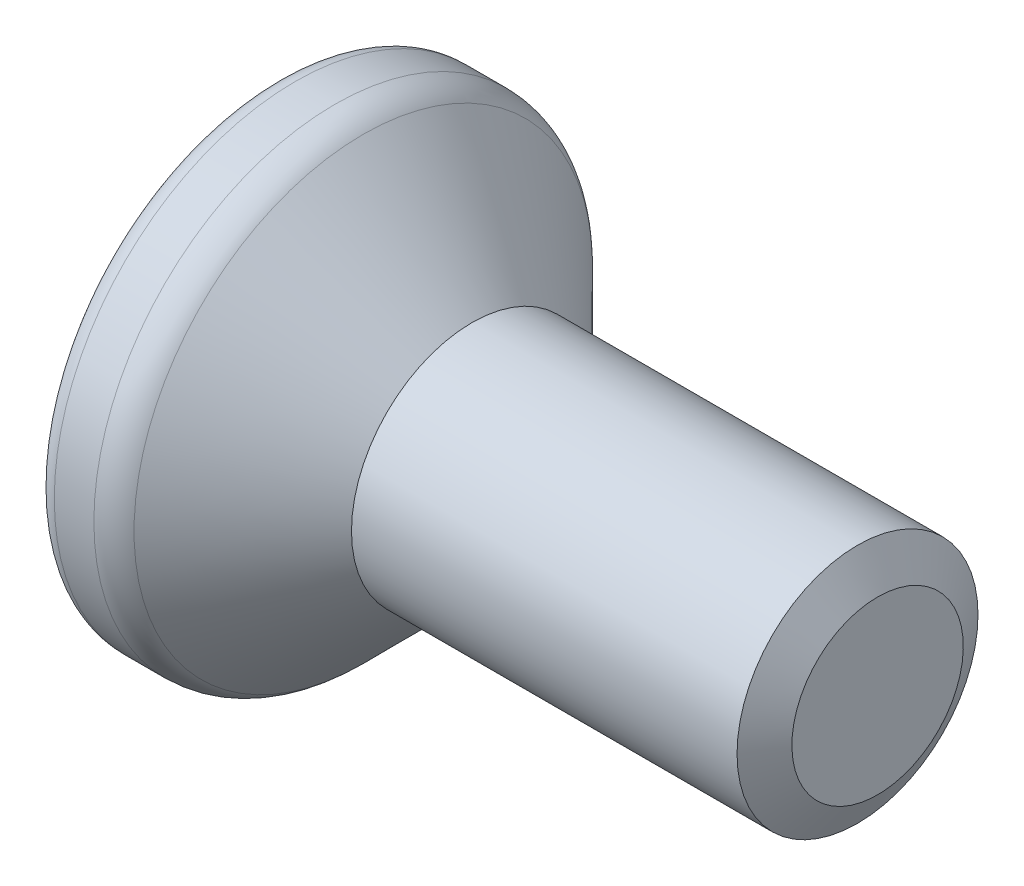
ISO-10303-21;
HEADER;
FILE_DESCRIPTION(('STEP AP214'),'2;1');
FILE_NAME('part.step','',(''),(''),'','','');
FILE_SCHEMA(('AUTOMOTIVE_DESIGN { 1 0 10303 214 1 1 1 1 }'));
ENDSEC;
DATA;
#1=APPLICATION_CONTEXT('core data for automotive mechanical design processes');
#2=APPLICATION_PROTOCOL_DEFINITION('international standard','automotive_design',2000,#1);
#3=PRODUCT_CONTEXT('',#1,'mechanical');
#4=PRODUCT('Part','Part','',(#3));
#5=PRODUCT_RELATED_PRODUCT_CATEGORY('part','',(#4));
#6=PRODUCT_DEFINITION_FORMATION('','',#4);
#7=PRODUCT_DEFINITION_CONTEXT('part definition',#1,'design');
#8=PRODUCT_DEFINITION('design','',#6,#7);
#9=PRODUCT_DEFINITION_SHAPE('','',#8);
#10=(LENGTH_UNIT() NAMED_UNIT(*) SI_UNIT(.MILLI.,.METRE.));
#11=(NAMED_UNIT(*) PLANE_ANGLE_UNIT() SI_UNIT($,.RADIAN.));
#12=(NAMED_UNIT(*) SI_UNIT($,.STERADIAN.) SOLID_ANGLE_UNIT());
#13=UNCERTAINTY_MEASURE_WITH_UNIT(LENGTH_MEASURE(1.E-05),#10,'distance_accuracy_value','');
#14=(GEOMETRIC_REPRESENTATION_CONTEXT(3) GLOBAL_UNCERTAINTY_ASSIGNED_CONTEXT((#13)) GLOBAL_UNIT_ASSIGNED_CONTEXT((#10,
#11,#12)) REPRESENTATION_CONTEXT('',''));
#15=CARTESIAN_POINT('',(0.,0.,0.));
#16=DIRECTION('',(0.,0.,1.));
#17=DIRECTION('',(1.,0.,0.));
#18=AXIS2_PLACEMENT_3D('',#15,#16,#17);
#19=CARTESIAN_POINT('',(7.5,0.,0.));
#20=DIRECTION('',(1.,0.,0.));
#21=DIRECTION('',(0.,1.,0.));
#22=AXIS2_PLACEMENT_3D('',#19,#20,#21);
#23=CYLINDRICAL_SURFACE('',#22,6.);
#24=CARTESIAN_POINT('',(-6.01421356237312,0.,0.));
#25=DIRECTION('',(-1.,0.,0.));
#26=DIRECTION('',(0.,-1.,0.));
#27=AXIS2_PLACEMENT_3D('',#24,#25,#26);
#28=CIRCLE('',#27,6.);
#29=CARTESIAN_POINT('',(-6.01421356237312,-6.,0.));
#30=VERTEX_POINT('',#29);
#31=EDGE_CURVE('E157',#30,#30,#28,.T.);
#32=ORIENTED_EDGE('',*,*,#31,.T.);
#33=EDGE_LOOP('',(#32));
#34=FACE_BOUND('',#33,.T.);
#35=CARTESIAN_POINT('',(-7.,0.,0.));
#36=DIRECTION('',(-1.,0.,0.));
#37=DIRECTION('',(0.,-1.,0.));
#38=AXIS2_PLACEMENT_3D('',#35,#36,#37);
#39=CIRCLE('',#38,6.);
#40=CARTESIAN_POINT('',(-7.,-6.,0.));
#41=VERTEX_POINT('',#40);
#42=EDGE_CURVE('E148',#41,#41,#39,.F.);
#43=ORIENTED_EDGE('',*,*,#42,.T.);
#44=EDGE_LOOP('',(#43));
#45=FACE_BOUND('',#44,.T.);
#46=ADVANCED_FACE('F37',(#34,#45),#23,.T.);
#47=CARTESIAN_POINT('',(-2.6,0.,0.));
#48=DIRECTION('',(-1.,0.,0.));
#49=DIRECTION('',(0.,-1.,0.));
#50=AXIS2_PLACEMENT_3D('',#47,#48,#49);
#51=CONICAL_SURFACE('',#50,3.,0.785398163397443);
#52=CARTESIAN_POINT('',(-5.30710678118658,0.,0.));
#53=DIRECTION('',(1.,0.,0.));
#54=DIRECTION('',(0.,1.,0.));
#55=AXIS2_PLACEMENT_3D('',#52,#53,#54);
#56=CIRCLE('',#55,5.70710678118655);
#57=CARTESIAN_POINT('',(-5.30710678118658,5.70710678118655,0.));
#58=VERTEX_POINT('',#57);
#59=EDGE_CURVE('E154',#58,#58,#56,.T.);
#60=ORIENTED_EDGE('',*,*,#59,.T.);
#61=EDGE_LOOP('',(#60));
#62=FACE_BOUND('',#61,.T.);
#63=CARTESIAN_POINT('',(-2.6,0.,0.));
#64=DIRECTION('',(1.,0.,0.));
#65=DIRECTION('',(0.,1.,0.));
#66=AXIS2_PLACEMENT_3D('',#63,#64,#65);
#67=CIRCLE('',#66,3.);
#68=CARTESIAN_POINT('',(-2.6,3.,0.));
#69=VERTEX_POINT('',#68);
#70=EDGE_CURVE('E140',#69,#69,#67,.T.);
#71=ORIENTED_EDGE('',*,*,#70,.F.);
#72=EDGE_LOOP('',(#71));
#73=FACE_BOUND('',#72,.T.);
#74=ADVANCED_FACE('F173',(#62,#73),#51,.T.);
#75=CARTESIAN_POINT('',(7.5,0.,0.));
#76=DIRECTION('',(1.,0.,0.));
#77=DIRECTION('',(0.,1.,0.));
#78=AXIS2_PLACEMENT_3D('',#75,#76,#77);
#79=CYLINDRICAL_SURFACE('',#78,3.);
#80=CARTESIAN_POINT('',(6.99999999999999,0.,0.));
#81=DIRECTION('',(1.,0.,0.));
#82=DIRECTION('',(0.,1.,0.));
#83=AXIS2_PLACEMENT_3D('',#80,#81,#82);
#84=CIRCLE('',#83,3.);
#85=CARTESIAN_POINT('',(6.99999999999999,3.,0.));
#86=VERTEX_POINT('',#85);
#87=EDGE_CURVE('E11',#86,#86,#84,.F.);
#88=ORIENTED_EDGE('',*,*,#87,.T.);
#89=EDGE_LOOP('',(#88));
#90=FACE_BOUND('',#89,.T.);
#91=ORIENTED_EDGE('',*,*,#70,.T.);
#92=EDGE_LOOP('',(#91));
#93=FACE_BOUND('',#92,.T.);
#94=ADVANCED_FACE('F179',(#90,#93),#79,.T.);
#95=CARTESIAN_POINT('',(7.5,3.,0.));
#96=DIRECTION('',(1.,0.,0.));
#97=DIRECTION('',(0.,1.,0.));
#98=AXIS2_PLACEMENT_3D('',#95,#96,#97);
#99=PLANE('',#98);
#100=CARTESIAN_POINT('',(7.5,0.,0.));
#101=DIRECTION('',(1.,0.,0.));
#102=DIRECTION('',(0.,1.,0.));
#103=AXIS2_PLACEMENT_3D('',#100,#101,#102);
#104=CIRCLE('',#103,2.13397459621556);
#105=CARTESIAN_POINT('',(7.5,2.13397459621556,0.));
#106=VERTEX_POINT('',#105);
#107=EDGE_CURVE('E46',#106,#106,#104,.T.);
#108=ORIENTED_EDGE('',*,*,#107,.T.);
#109=EDGE_LOOP('',(#108));
#110=FACE_BOUND('',#109,.T.);
#111=ADVANCED_FACE('F162',(#110),#99,.T.);
#112=CARTESIAN_POINT('',(-7.5,0.,0.));
#113=DIRECTION('',(-1.,0.,0.));
#114=DIRECTION('',(0.,-1.,0.));
#115=AXIS2_PLACEMENT_3D('',#112,#113,#114);
#116=PLANE('',#115);
#117=DIRECTION('',(0.,0.5,-0.866025403784438));
#118=VECTOR('',#117,1.);
#119=CARTESIAN_POINT('',(-7.5,1.15470053837925,2.));
#120=LINE('',#119,#118);
#121=CARTESIAN_POINT('',(-7.5,1.15470053837925,2.));
#122=VERTEX_POINT('',#121);
#123=CARTESIAN_POINT('',(-7.5,2.3094010767585,0.));
#124=VERTEX_POINT('',#123);
#125=EDGE_CURVE('E53',#122,#124,#120,.T.);
#126=ORIENTED_EDGE('',*,*,#125,.F.);
#127=DIRECTION('',(0.,1.,0.));
#128=VECTOR('',#127,1.);
#129=CARTESIAN_POINT('',(-7.5,-1.15470053837926,2.));
#130=LINE('',#129,#128);
#131=CARTESIAN_POINT('',(-7.5,-1.15470053837926,2.));
#132=VERTEX_POINT('',#131);
#133=EDGE_CURVE('E136',#132,#122,#130,.T.);
#134=ORIENTED_EDGE('',*,*,#133,.F.);
#135=DIRECTION('',(0.,0.5,0.866025403784439));
#136=VECTOR('',#135,1.);
#137=CARTESIAN_POINT('',(-7.5,-2.30940107675851,0.));
#138=LINE('',#137,#136);
#139=CARTESIAN_POINT('',(-7.5,-2.30940107675851,0.));
#140=VERTEX_POINT('',#139);
#141=EDGE_CURVE('E134',#140,#132,#138,.T.);
#142=ORIENTED_EDGE('',*,*,#141,.F.);
#143=DIRECTION('',(0.,-0.5,0.866025403784439));
#144=VECTOR('',#143,1.);
#145=CARTESIAN_POINT('',(-7.5,-1.15470053837925,-2.));
#146=LINE('',#145,#144);
#147=CARTESIAN_POINT('',(-7.5,-1.15470053837925,-2.));
#148=VERTEX_POINT('',#147);
#149=EDGE_CURVE('E101',#148,#140,#146,.T.);
#150=ORIENTED_EDGE('',*,*,#149,.F.);
#151=DIRECTION('',(0.,-1.,0.));
#152=VECTOR('',#151,1.);
#153=CARTESIAN_POINT('',(-7.5,1.15470053837925,-2.));
#154=LINE('',#153,#152);
#155=CARTESIAN_POINT('',(-7.5,1.15470053837925,-2.));
#156=VERTEX_POINT('',#155);
#157=EDGE_CURVE('E130',#156,#148,#154,.T.);
#158=ORIENTED_EDGE('',*,*,#157,.F.);
#159=DIRECTION('',(0.,-0.5,-0.866025403784439));
#160=VECTOR('',#159,1.);
#161=CARTESIAN_POINT('',(-7.5,2.3094010767585,0.));
#162=LINE('',#161,#160);
#163=EDGE_CURVE('E127',#124,#156,#162,.T.);
#164=ORIENTED_EDGE('',*,*,#163,.F.);
#165=EDGE_LOOP('',(#126,#134,#142,#150,#158,#164));
#166=FACE_BOUND('',#165,.T.);
#167=CARTESIAN_POINT('',(-7.5,0.,0.));
#168=DIRECTION('',(-1.,0.,0.));
#169=DIRECTION('',(0.,-1.,0.));
#170=AXIS2_PLACEMENT_3D('',#167,#168,#169);
#171=CIRCLE('',#170,5.5);
#172=CARTESIAN_POINT('',(-7.5,-5.5,0.));
#173=VERTEX_POINT('',#172);
#174=EDGE_CURVE('E151',#173,#173,#171,.T.);
#175=ORIENTED_EDGE('',*,*,#174,.T.);
#176=EDGE_LOOP('',(#175));
#177=FACE_BOUND('',#176,.T.);
#178=ADVANCED_FACE('F188',(#166,#177),#116,.T.);
#179=CARTESIAN_POINT('',(-7.,0.,0.));
#180=DIRECTION('',(-1.,0.,0.));
#181=DIRECTION('',(0.,-1.,0.));
#182=AXIS2_PLACEMENT_3D('',#179,#180,#181);
#183=TOROIDAL_SURFACE('',#182,5.5,0.5);
#184=ORIENTED_EDGE('',*,*,#174,.F.);
#185=EDGE_LOOP('',(#184));
#186=FACE_BOUND('',#185,.T.);
#187=ORIENTED_EDGE('',*,*,#42,.F.);
#188=EDGE_LOOP('',(#187));
#189=FACE_BOUND('',#188,.T.);
#190=ADVANCED_FACE('F185',(#186,#189),#183,.T.);
#191=CARTESIAN_POINT('',(-6.01421356237312,0.,0.));
#192=DIRECTION('',(-1.,0.,0.));
#193=DIRECTION('',(0.,-1.,0.));
#194=AXIS2_PLACEMENT_3D('',#191,#192,#193);
#195=TOROIDAL_SURFACE('',#194,5.,1.);
#196=ORIENTED_EDGE('',*,*,#31,.F.);
#197=EDGE_LOOP('',(#196));
#198=FACE_BOUND('',#197,.T.);
#199=ORIENTED_EDGE('',*,*,#59,.F.);
#200=EDGE_LOOP('',(#199));
#201=FACE_BOUND('',#200,.T.);
#202=ADVANCED_FACE('F187',(#198,#201),#195,.T.);
#203=CARTESIAN_POINT('',(-5.,1.15470053837925,2.));
#204=DIRECTION('',(0.,0.866025403784438,0.5));
#205=DIRECTION('',(0.,-0.5,0.866025403784439));
#206=AXIS2_PLACEMENT_3D('',#203,#204,#205);
#207=PLANE('',#206);
#208=ORIENTED_EDGE('',*,*,#125,.T.);
#209=DIRECTION('',(-1.,0.,0.));
#210=VECTOR('',#209,1.);
#211=CARTESIAN_POINT('',(-5.,2.3094010767585,0.));
#212=LINE('',#211,#210);
#213=CARTESIAN_POINT('',(-5.,2.3094010767585,0.));
#214=VERTEX_POINT('',#213);
#215=EDGE_CURVE('E83',#214,#124,#212,.T.);
#216=ORIENTED_EDGE('',*,*,#215,.F.);
#217=DIRECTION('',(0.,0.5,-0.866025403784438));
#218=VECTOR('',#217,1.);
#219=CARTESIAN_POINT('',(-5.,1.15470053837925,2.));
#220=LINE('',#219,#218);
#221=CARTESIAN_POINT('',(-5.,1.15470053837925,2.));
#222=VERTEX_POINT('',#221);
#223=EDGE_CURVE('E138',#222,#214,#220,.T.);
#224=ORIENTED_EDGE('',*,*,#223,.F.);
#225=DIRECTION('',(-1.,0.,0.));
#226=VECTOR('',#225,1.);
#227=CARTESIAN_POINT('',(-5.,1.15470053837925,2.));
#228=LINE('',#227,#226);
#229=EDGE_CURVE('E61',#222,#122,#228,.T.);
#230=ORIENTED_EDGE('',*,*,#229,.T.);
#231=EDGE_LOOP('',(#208,#216,#224,#230));
#232=FACE_BOUND('',#231,.T.);
#233=ADVANCED_FACE('F191',(#232),#207,.F.);
#234=CARTESIAN_POINT('',(-5.,-1.15470053837925,2.));
#235=DIRECTION('',(0.,0.,1.));
#236=DIRECTION('',(0.,-1.,0.));
#237=AXIS2_PLACEMENT_3D('',#234,#235,#236);
#238=PLANE('',#237);
#239=ORIENTED_EDGE('',*,*,#133,.T.);
#240=ORIENTED_EDGE('',*,*,#229,.F.);
#241=DIRECTION('',(0.,1.,0.));
#242=VECTOR('',#241,1.);
#243=CARTESIAN_POINT('',(-5.,-1.15470053837925,2.));
#244=LINE('',#243,#242);
#245=CARTESIAN_POINT('',(-5.,-1.15470053837925,2.));
#246=VERTEX_POINT('',#245);
#247=EDGE_CURVE('E113',#246,#222,#244,.T.);
#248=ORIENTED_EDGE('',*,*,#247,.F.);
#249=DIRECTION('',(-1.,0.,0.));
#250=VECTOR('',#249,1.);
#251=CARTESIAN_POINT('',(-5.,-1.15470053837925,2.));
#252=LINE('',#251,#250);
#253=EDGE_CURVE('E105',#246,#132,#252,.T.);
#254=ORIENTED_EDGE('',*,*,#253,.T.);
#255=EDGE_LOOP('',(#239,#240,#248,#254));
#256=FACE_BOUND('',#255,.T.);
#257=ADVANCED_FACE('F196',(#256),#238,.F.);
#258=CARTESIAN_POINT('',(-5.,-2.3094010767585,0.));
#259=DIRECTION('',(0.,-0.866025403784439,0.5));
#260=DIRECTION('',(0.,-0.5,-0.866025403784439));
#261=AXIS2_PLACEMENT_3D('',#258,#259,#260);
#262=PLANE('',#261);
#263=ORIENTED_EDGE('',*,*,#141,.T.);
#264=ORIENTED_EDGE('',*,*,#253,.F.);
#265=DIRECTION('',(0.,0.5,0.866025403784439));
#266=VECTOR('',#265,1.);
#267=CARTESIAN_POINT('',(-5.,-2.3094010767585,0.));
#268=LINE('',#267,#266);
#269=CARTESIAN_POINT('',(-5.,-2.3094010767585,0.));
#270=VERTEX_POINT('',#269);
#271=EDGE_CURVE('E109',#270,#246,#268,.T.);
#272=ORIENTED_EDGE('',*,*,#271,.F.);
#273=DIRECTION('',(-1.,0.,0.));
#274=VECTOR('',#273,1.);
#275=CARTESIAN_POINT('',(-5.,-2.3094010767585,0.));
#276=LINE('',#275,#274);
#277=EDGE_CURVE('E94',#270,#140,#276,.T.);
#278=ORIENTED_EDGE('',*,*,#277,.T.);
#279=EDGE_LOOP('',(#263,#264,#272,#278));
#280=FACE_BOUND('',#279,.T.);
#281=ADVANCED_FACE('F110',(#280),#262,.F.);
#282=CARTESIAN_POINT('',(-5.,-1.15470053837925,-2.));
#283=DIRECTION('',(0.,-0.866025403784439,-0.5));
#284=DIRECTION('',(0.,0.5,-0.866025403784439));
#285=AXIS2_PLACEMENT_3D('',#282,#283,#284);
#286=PLANE('',#285);
#287=ORIENTED_EDGE('',*,*,#149,.T.);
#288=ORIENTED_EDGE('',*,*,#277,.F.);
#289=DIRECTION('',(0.,-0.5,0.866025403784439));
#290=VECTOR('',#289,1.);
#291=CARTESIAN_POINT('',(-5.,-1.15470053837925,-2.));
#292=LINE('',#291,#290);
#293=CARTESIAN_POINT('',(-5.,-1.15470053837925,-2.));
#294=VERTEX_POINT('',#293);
#295=EDGE_CURVE('E98',#294,#270,#292,.T.);
#296=ORIENTED_EDGE('',*,*,#295,.F.);
#297=DIRECTION('',(-1.,0.,0.));
#298=VECTOR('',#297,1.);
#299=CARTESIAN_POINT('',(-5.,-1.15470053837925,-2.));
#300=LINE('',#299,#298);
#301=EDGE_CURVE('E106',#294,#148,#300,.T.);
#302=ORIENTED_EDGE('',*,*,#301,.T.);
#303=EDGE_LOOP('',(#287,#288,#296,#302));
#304=FACE_BOUND('',#303,.T.);
#305=ADVANCED_FACE('F96',(#304),#286,.F.);
#306=CARTESIAN_POINT('',(-5.,1.15470053837925,-2.));
#307=DIRECTION('',(0.,0.,-1.));
#308=DIRECTION('',(-1.,0.,0.));
#309=AXIS2_PLACEMENT_3D('',#306,#307,#308);
#310=PLANE('',#309);
#311=ORIENTED_EDGE('',*,*,#157,.T.);
#312=ORIENTED_EDGE('',*,*,#301,.F.);
#313=DIRECTION('',(0.,-1.,0.));
#314=VECTOR('',#313,1.);
#315=CARTESIAN_POINT('',(-5.,1.15470053837925,-2.));
#316=LINE('',#315,#314);
#317=CARTESIAN_POINT('',(-5.,1.15470053837925,-2.));
#318=VERTEX_POINT('',#317);
#319=EDGE_CURVE('E119',#318,#294,#316,.T.);
#320=ORIENTED_EDGE('',*,*,#319,.F.);
#321=DIRECTION('',(-1.,0.,0.));
#322=VECTOR('',#321,1.);
#323=CARTESIAN_POINT('',(-5.,1.15470053837925,-2.));
#324=LINE('',#323,#322);
#325=EDGE_CURVE('E143',#318,#156,#324,.T.);
#326=ORIENTED_EDGE('',*,*,#325,.T.);
#327=EDGE_LOOP('',(#311,#312,#320,#326));
#328=FACE_BOUND('',#327,.T.);
#329=ADVANCED_FACE('F216',(#328),#310,.F.);
#330=CARTESIAN_POINT('',(-5.,2.3094010767585,0.));
#331=DIRECTION('',(0.,0.866025403784439,-0.5));
#332=DIRECTION('',(0.,0.5,0.866025403784439));
#333=AXIS2_PLACEMENT_3D('',#330,#331,#332);
#334=PLANE('',#333);
#335=ORIENTED_EDGE('',*,*,#163,.T.);
#336=ORIENTED_EDGE('',*,*,#325,.F.);
#337=DIRECTION('',(0.,-0.5,-0.866025403784439));
#338=VECTOR('',#337,1.);
#339=CARTESIAN_POINT('',(-5.,2.3094010767585,0.));
#340=LINE('',#339,#338);
#341=EDGE_CURVE('E121',#214,#318,#340,.T.);
#342=ORIENTED_EDGE('',*,*,#341,.F.);
#343=ORIENTED_EDGE('',*,*,#215,.T.);
#344=EDGE_LOOP('',(#335,#336,#342,#343));
#345=FACE_BOUND('',#344,.T.);
#346=ADVANCED_FACE('F169',(#345),#334,.F.);
#347=CARTESIAN_POINT('',(-5.,0.,0.));
#348=DIRECTION('',(-1.,0.,0.));
#349=DIRECTION('',(0.,-1.,0.));
#350=AXIS2_PLACEMENT_3D('',#347,#348,#349);
#351=PLANE('',#350);
#352=ORIENTED_EDGE('',*,*,#223,.T.);
#353=ORIENTED_EDGE('',*,*,#341,.T.);
#354=ORIENTED_EDGE('',*,*,#319,.T.);
#355=ORIENTED_EDGE('',*,*,#295,.T.);
#356=ORIENTED_EDGE('',*,*,#271,.T.);
#357=ORIENTED_EDGE('',*,*,#247,.T.);
#358=EDGE_LOOP('',(#352,#353,#354,#355,#356,#357));
#359=FACE_BOUND('',#358,.T.);
#360=ADVANCED_FACE('F116',(#359),#351,.T.);
#361=CARTESIAN_POINT('',(7.5,0.,0.));
#362=DIRECTION('',(-1.,0.,0.));
#363=DIRECTION('',(0.,-1.,0.));
#364=AXIS2_PLACEMENT_3D('',#361,#362,#363);
#365=CONICAL_SURFACE('',#364,2.13397459621556,1.0471975511966);
#366=ORIENTED_EDGE('',*,*,#87,.F.);
#367=EDGE_LOOP('',(#366));
#368=FACE_BOUND('',#367,.T.);
#369=ORIENTED_EDGE('',*,*,#107,.F.);
#370=EDGE_LOOP('',(#369));
#371=FACE_BOUND('',#370,.T.);
#372=ADVANCED_FACE('F40',(#368,#371),#365,.T.);
#373=CLOSED_SHELL('',(#46,#74,#94,#111,#178,#190,#202,#233,#257,#281,#305,#329,#346,#360,#372));
#374=MANIFOLD_SOLID_BREP('B2',#373);
#375=ADVANCED_BREP_SHAPE_REPRESENTATION('',(#18,#374),#14);
#376=SHAPE_DEFINITION_REPRESENTATION(#9,#375);
ENDSEC;
END-ISO-10303-21;
